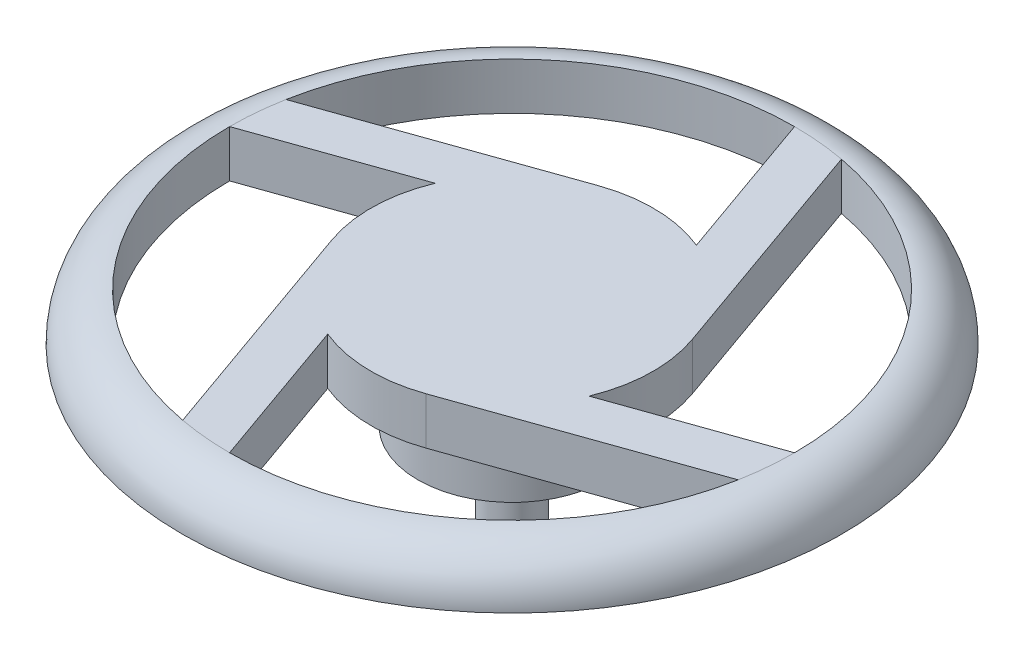
ISO-10303-21;
HEADER;
FILE_DESCRIPTION(('STEP AP214'),'2;1');
FILE_NAME('part.step','',(''),(''),'','','');
FILE_SCHEMA(('AUTOMOTIVE_DESIGN { 1 0 10303 214 1 1 1 1 }'));
ENDSEC;
DATA;
#1=APPLICATION_CONTEXT('core data for automotive mechanical design processes');
#2=APPLICATION_PROTOCOL_DEFINITION('international standard','automotive_design',2000,#1);
#3=PRODUCT_CONTEXT('',#1,'mechanical');
#4=PRODUCT('Part','Part','',(#3));
#5=PRODUCT_RELATED_PRODUCT_CATEGORY('part','',(#4));
#6=PRODUCT_DEFINITION_FORMATION('','',#4);
#7=PRODUCT_DEFINITION_CONTEXT('part definition',#1,'design');
#8=PRODUCT_DEFINITION('design','',#6,#7);
#9=PRODUCT_DEFINITION_SHAPE('','',#8);
#10=(LENGTH_UNIT() NAMED_UNIT(*) SI_UNIT(.MILLI.,.METRE.));
#11=(NAMED_UNIT(*) PLANE_ANGLE_UNIT() SI_UNIT($,.RADIAN.));
#12=(NAMED_UNIT(*) SI_UNIT($,.STERADIAN.) SOLID_ANGLE_UNIT());
#13=UNCERTAINTY_MEASURE_WITH_UNIT(LENGTH_MEASURE(1.E-05),#10,'distance_accuracy_value','');
#14=(GEOMETRIC_REPRESENTATION_CONTEXT(3) GLOBAL_UNCERTAINTY_ASSIGNED_CONTEXT((#13)) GLOBAL_UNIT_ASSIGNED_CONTEXT((#10,
#11,#12)) REPRESENTATION_CONTEXT('',''));
#15=CARTESIAN_POINT('',(0.,0.,0.));
#16=DIRECTION('',(0.,0.,1.));
#17=DIRECTION('',(1.,0.,0.));
#18=AXIS2_PLACEMENT_3D('',#15,#16,#17);
#19=CARTESIAN_POINT('',(0.,0.,0.));
#20=DIRECTION('',(0.,-1.,0.));
#21=DIRECTION('',(0.,0.,-1.));
#22=AXIS2_PLACEMENT_3D('',#19,#20,#21);
#23=TOROIDAL_SURFACE('',#22,60.,10.);
#24=CARTESIAN_POINT('',(0.,0.,0.));
#25=DIRECTION('',(0.,1.,0.));
#26=DIRECTION('',(0.,0.,1.));
#27=AXIS2_PLACEMENT_3D('',#24,#25,#26);
#28=CIRCLE('',#27,70.);
#29=CARTESIAN_POINT('',(0.,0.,70.));
#30=VERTEX_POINT('',#29);
#31=EDGE_CURVE('E274',#30,#30,#28,.T.);
#32=ORIENTED_EDGE('',*,*,#31,.T.);
#33=EDGE_LOOP('',(#32));
#34=FACE_BOUND('',#33,.T.);
#35=CARTESIAN_POINT('',(0.,10.,0.));
#36=DIRECTION('',(0.,-1.,0.));
#37=DIRECTION('',(0.,0.,-1.));
#38=AXIS2_PLACEMENT_3D('',#35,#36,#37);
#39=CIRCLE('',#38,60.);
#40=CARTESIAN_POINT('',(58.9897948556636,10.,10.9637631717731));
#41=VERTEX_POINT('',#40);
#42=CARTESIAN_POINT('',(60.,10.,0.));
#43=VERTEX_POINT('',#42);
#44=EDGE_CURVE('E74',#41,#43,#39,.F.);
#45=ORIENTED_EDGE('',*,*,#44,.F.);
#46=CARTESIAN_POINT('',(0.,10.,0.));
#47=DIRECTION('',(0.,1.,0.));
#48=DIRECTION('',(0.,0.,1.));
#49=AXIS2_PLACEMENT_3D('',#46,#47,#48);
#50=CIRCLE('',#49,60.);
#51=CARTESIAN_POINT('',(6.31439345255558E-13,10.,60.));
#52=VERTEX_POINT('',#51);
#53=EDGE_CURVE('E276',#52,#41,#50,.T.);
#54=ORIENTED_EDGE('',*,*,#53,.F.);
#55=CARTESIAN_POINT('',(0.,10.,0.));
#56=DIRECTION('',(0.,-1.,0.));
#57=DIRECTION('',(0.,0.,-1.));
#58=AXIS2_PLACEMENT_3D('',#55,#56,#57);
#59=CIRCLE('',#58,60.);
#60=CARTESIAN_POINT('',(-10.9637631717725,10.,58.9897948556637));
#61=VERTEX_POINT('',#60);
#62=EDGE_CURVE('E332',#61,#52,#59,.F.);
#63=ORIENTED_EDGE('',*,*,#62,.F.);
#64=CARTESIAN_POINT('',(-60.,10.,0.));
#65=VERTEX_POINT('',#64);
#66=EDGE_CURVE('E444',#65,#61,#50,.T.);
#67=ORIENTED_EDGE('',*,*,#66,.F.);
#68=CARTESIAN_POINT('',(0.,10.,0.));
#69=DIRECTION('',(0.,-1.,0.));
#70=DIRECTION('',(0.,0.,-1.));
#71=AXIS2_PLACEMENT_3D('',#68,#69,#70);
#72=CIRCLE('',#71,60.);
#73=CARTESIAN_POINT('',(-58.9897948556636,10.,-10.9637631717731));
#74=VERTEX_POINT('',#73);
#75=EDGE_CURVE('E335',#74,#65,#72,.F.);
#76=ORIENTED_EDGE('',*,*,#75,.F.);
#77=CARTESIAN_POINT('',(-2.09488880330588E-13,10.,-60.));
#78=VERTEX_POINT('',#77);
#79=EDGE_CURVE('E275',#78,#74,#50,.T.);
#80=ORIENTED_EDGE('',*,*,#79,.F.);
#81=CARTESIAN_POINT('',(0.,10.,0.));
#82=DIRECTION('',(0.,-1.,0.));
#83=DIRECTION('',(0.,0.,-1.));
#84=AXIS2_PLACEMENT_3D('',#81,#82,#83);
#85=CIRCLE('',#84,60.);
#86=CARTESIAN_POINT('',(10.9637631717729,10.,-58.9897948556636));
#87=VERTEX_POINT('',#86);
#88=EDGE_CURVE('E337',#87,#78,#85,.F.);
#89=ORIENTED_EDGE('',*,*,#88,.F.);
#90=EDGE_CURVE('E271',#43,#87,#50,.T.);
#91=ORIENTED_EDGE('',*,*,#90,.F.);
#92=EDGE_LOOP('',(#45,#54,#63,#67,#76,#80,#89,#91));
#93=FACE_BOUND('',#92,.T.);
#94=ADVANCED_FACE('F71',(#34,#93),#23,.T.);
#95=CARTESIAN_POINT('',(0.,10.,0.));
#96=DIRECTION('',(0.,-1.,0.));
#97=DIRECTION('',(0.,0.,-1.));
#98=AXIS2_PLACEMENT_3D('',#95,#96,#97);
#99=CYLINDRICAL_SURFACE('',#98,30.);
#100=DIRECTION('',(0.,-1.,0.));
#101=VECTOR('',#100,1.);
#102=CARTESIAN_POINT('',(28.2842712474619,10.,-10.0000000000001));
#103=LINE('',#102,#101);
#104=CARTESIAN_POINT('',(28.2842712474619,10.,-10.0000000000001));
#105=VERTEX_POINT('',#104);
#106=CARTESIAN_POINT('',(28.2842712474619,0.,-10.0000000000001));
#107=VERTEX_POINT('',#106);
#108=EDGE_CURVE('E260',#105,#107,#103,.T.);
#109=ORIENTED_EDGE('',*,*,#108,.F.);
#110=CARTESIAN_POINT('',(0.,10.,0.));
#111=DIRECTION('',(0.,1.,0.));
#112=DIRECTION('',(1.,0.,0.));
#113=AXIS2_PLACEMENT_3D('',#110,#111,#112);
#114=CIRCLE('',#113,30.);
#115=CARTESIAN_POINT('',(27.7485177344559,10.,11.402620906642));
#116=VERTEX_POINT('',#115);
#117=EDGE_CURVE('E299',#116,#105,#114,.T.);
#118=ORIENTED_EDGE('',*,*,#117,.F.);
#119=DIRECTION('',(0.,-1.,0.));
#120=VECTOR('',#119,1.);
#121=CARTESIAN_POINT('',(27.7485177344559,10.,11.402620906642));
#122=LINE('',#121,#120);
#123=CARTESIAN_POINT('',(27.7485177344559,0.,11.402620906642));
#124=VERTEX_POINT('',#123);
#125=EDGE_CURVE('E310',#124,#116,#122,.F.);
#126=ORIENTED_EDGE('',*,*,#125,.F.);
#127=CARTESIAN_POINT('',(0.,0.,0.));
#128=DIRECTION('',(0.,1.,0.));
#129=DIRECTION('',(1.,0.,0.));
#130=AXIS2_PLACEMENT_3D('',#127,#128,#129);
#131=CIRCLE('',#130,30.);
#132=EDGE_CURVE('E316',#124,#107,#131,.T.);
#133=ORIENTED_EDGE('',*,*,#132,.T.);
#134=EDGE_LOOP('',(#109,#118,#126,#133));
#135=FACE_BOUND('',#134,.T.);
#136=ADVANCED_FACE('F358',(#135),#99,.T.);
#137=DIRECTION('',(0.,-1.,0.));
#138=VECTOR('',#137,1.);
#139=CARTESIAN_POINT('',(-28.2842712474618,10.,10.0000000000003));
#140=LINE('',#139,#138);
#141=CARTESIAN_POINT('',(-28.2842712474618,10.,10.0000000000003));
#142=VERTEX_POINT('',#141);
#143=CARTESIAN_POINT('',(-28.2842712474618,0.,10.0000000000003));
#144=VERTEX_POINT('',#143);
#145=EDGE_CURVE('E215',#142,#144,#140,.T.);
#146=ORIENTED_EDGE('',*,*,#145,.F.);
#147=CARTESIAN_POINT('',(-27.7485177344559,10.,-11.402620906642));
#148=VERTEX_POINT('',#147);
#149=EDGE_CURVE('E384',#148,#142,#114,.T.);
#150=ORIENTED_EDGE('',*,*,#149,.F.);
#151=DIRECTION('',(0.,-1.,0.));
#152=VECTOR('',#151,1.);
#153=CARTESIAN_POINT('',(-27.7485177344559,10.,-11.402620906642));
#154=LINE('',#153,#152);
#155=CARTESIAN_POINT('',(-27.7485177344559,0.,-11.402620906642));
#156=VERTEX_POINT('',#155);
#157=EDGE_CURVE('E95',#156,#148,#154,.F.);
#158=ORIENTED_EDGE('',*,*,#157,.F.);
#159=EDGE_CURVE('E436',#156,#144,#131,.T.);
#160=ORIENTED_EDGE('',*,*,#159,.T.);
#161=EDGE_LOOP('',(#146,#150,#158,#160));
#162=FACE_BOUND('',#161,.T.);
#163=ADVANCED_FACE('F409',(#162),#99,.T.);
#164=CARTESIAN_POINT('',(11.4026209066419,10.,-27.7485177344559));
#165=VERTEX_POINT('',#164);
#166=CARTESIAN_POINT('',(-10.,10.,-28.2842712474619));
#167=VERTEX_POINT('',#166);
#168=EDGE_CURVE('E314',#165,#167,#114,.T.);
#169=ORIENTED_EDGE('',*,*,#168,.F.);
#170=DIRECTION('',(0.,-1.,0.));
#171=VECTOR('',#170,1.);
#172=CARTESIAN_POINT('',(11.4026209066419,10.,-27.7485177344559));
#173=LINE('',#172,#171);
#174=CARTESIAN_POINT('',(11.4026209066419,0.,-27.7485177344559));
#175=VERTEX_POINT('',#174);
#176=EDGE_CURVE('E246',#175,#165,#173,.F.);
#177=ORIENTED_EDGE('',*,*,#176,.F.);
#178=CARTESIAN_POINT('',(-10.,0.,-28.2842712474619));
#179=VERTEX_POINT('',#178);
#180=EDGE_CURVE('E319',#175,#179,#131,.T.);
#181=ORIENTED_EDGE('',*,*,#180,.T.);
#182=DIRECTION('',(0.,-1.,0.));
#183=VECTOR('',#182,1.);
#184=CARTESIAN_POINT('',(-10.,10.,-28.2842712474619));
#185=LINE('',#184,#183);
#186=EDGE_CURVE('E232',#167,#179,#185,.T.);
#187=ORIENTED_EDGE('',*,*,#186,.F.);
#188=EDGE_LOOP('',(#169,#177,#181,#187));
#189=FACE_BOUND('',#188,.T.);
#190=ADVANCED_FACE('F382',(#189),#99,.T.);
#191=CARTESIAN_POINT('',(0.,10.,0.));
#192=DIRECTION('',(0.,-1.,0.));
#193=DIRECTION('',(0.,0.,-1.));
#194=AXIS2_PLACEMENT_3D('',#191,#192,#193);
#195=CYLINDRICAL_SURFACE('',#194,60.);
#196=ORIENTED_EDGE('',*,*,#90,.T.);
#197=DIRECTION('',(0.,-1.,0.));
#198=VECTOR('',#197,1.);
#199=CARTESIAN_POINT('',(10.9637631717729,10.,-58.9897948556636));
#200=LINE('',#199,#198);
#201=CARTESIAN_POINT('',(10.9637631717729,0.,-58.9897948556636));
#202=VERTEX_POINT('',#201);
#203=EDGE_CURVE('E328',#87,#202,#200,.T.);
#204=ORIENTED_EDGE('',*,*,#203,.T.);
#205=CARTESIAN_POINT('',(0.,0.,0.));
#206=DIRECTION('',(0.,1.,0.));
#207=DIRECTION('',(0.,0.,1.));
#208=AXIS2_PLACEMENT_3D('',#205,#206,#207);
#209=CIRCLE('',#208,60.);
#210=CARTESIAN_POINT('',(60.,0.,0.));
#211=VERTEX_POINT('',#210);
#212=EDGE_CURVE('E201',#211,#202,#209,.T.);
#213=ORIENTED_EDGE('',*,*,#212,.F.);
#214=DIRECTION('',(0.,-1.,0.));
#215=VECTOR('',#214,1.);
#216=CARTESIAN_POINT('',(60.,10.,0.));
#217=LINE('',#216,#215);
#218=EDGE_CURVE('E306',#43,#211,#217,.T.);
#219=ORIENTED_EDGE('',*,*,#218,.F.);
#220=EDGE_LOOP('',(#196,#204,#213,#219));
#221=FACE_BOUND('',#220,.T.);
#222=ADVANCED_FACE('F349',(#221),#195,.F.);
#223=ORIENTED_EDGE('',*,*,#66,.T.);
#224=DIRECTION('',(0.,-1.,0.));
#225=VECTOR('',#224,1.);
#226=CARTESIAN_POINT('',(-10.9637631717725,10.,58.9897948556637));
#227=LINE('',#226,#225);
#228=CARTESIAN_POINT('',(-10.9637631717725,0.,58.9897948556637));
#229=VERTEX_POINT('',#228);
#230=EDGE_CURVE('E325',#61,#229,#227,.T.);
#231=ORIENTED_EDGE('',*,*,#230,.T.);
#232=CARTESIAN_POINT('',(-60.,0.,0.));
#233=VERTEX_POINT('',#232);
#234=EDGE_CURVE('E198',#233,#229,#209,.T.);
#235=ORIENTED_EDGE('',*,*,#234,.F.);
#236=DIRECTION('',(0.,-1.,0.));
#237=VECTOR('',#236,1.);
#238=CARTESIAN_POINT('',(-60.,10.,0.));
#239=LINE('',#238,#237);
#240=EDGE_CURVE('E242',#65,#233,#239,.T.);
#241=ORIENTED_EDGE('',*,*,#240,.F.);
#242=EDGE_LOOP('',(#223,#231,#235,#241));
#243=FACE_BOUND('',#242,.T.);
#244=ADVANCED_FACE('F451',(#243),#195,.F.);
#245=DIRECTION('',(0.,-1.,0.));
#246=VECTOR('',#245,1.);
#247=CARTESIAN_POINT('',(-2.09488880330588E-13,10.,-60.));
#248=LINE('',#247,#246);
#249=CARTESIAN_POINT('',(-2.15105711021124E-13,0.,-60.));
#250=VERTEX_POINT('',#249);
#251=EDGE_CURVE('E199',#78,#250,#248,.T.);
#252=ORIENTED_EDGE('',*,*,#251,.F.);
#253=ORIENTED_EDGE('',*,*,#79,.T.);
#254=DIRECTION('',(0.,-1.,0.));
#255=VECTOR('',#254,1.);
#256=CARTESIAN_POINT('',(-58.9897948556636,10.,-10.9637631717731));
#257=LINE('',#256,#255);
#258=CARTESIAN_POINT('',(-58.9897948556636,0.,-10.9637631717731));
#259=VERTEX_POINT('',#258);
#260=EDGE_CURVE('E322',#74,#259,#257,.T.);
#261=ORIENTED_EDGE('',*,*,#260,.T.);
#262=EDGE_CURVE('E280',#250,#259,#209,.T.);
#263=ORIENTED_EDGE('',*,*,#262,.F.);
#264=EDGE_LOOP('',(#252,#253,#261,#263));
#265=FACE_BOUND('',#264,.T.);
#266=ADVANCED_FACE('F402',(#265),#195,.F.);
#267=CARTESIAN_POINT('',(-11.4026209066417,10.,27.748517734456));
#268=VERTEX_POINT('',#267);
#269=CARTESIAN_POINT('',(10.,10.,28.2842712474619));
#270=VERTEX_POINT('',#269);
#271=EDGE_CURVE('E315',#268,#270,#114,.T.);
#272=ORIENTED_EDGE('',*,*,#271,.F.);
#273=DIRECTION('',(0.,-1.,0.));
#274=VECTOR('',#273,1.);
#275=CARTESIAN_POINT('',(-11.4026209066417,10.,27.748517734456));
#276=LINE('',#275,#274);
#277=CARTESIAN_POINT('',(-11.4026209066417,0.,27.748517734456));
#278=VERTEX_POINT('',#277);
#279=EDGE_CURVE('E417',#278,#268,#276,.F.);
#280=ORIENTED_EDGE('',*,*,#279,.F.);
#281=CARTESIAN_POINT('',(10.,0.,28.2842712474619));
#282=VERTEX_POINT('',#281);
#283=EDGE_CURVE('E205',#278,#282,#131,.T.);
#284=ORIENTED_EDGE('',*,*,#283,.T.);
#285=DIRECTION('',(0.,-1.,0.));
#286=VECTOR('',#285,1.);
#287=CARTESIAN_POINT('',(10.,10.,28.2842712474619));
#288=LINE('',#287,#286);
#289=EDGE_CURVE('E295',#270,#282,#288,.T.);
#290=ORIENTED_EDGE('',*,*,#289,.F.);
#291=EDGE_LOOP('',(#272,#280,#284,#290));
#292=FACE_BOUND('',#291,.T.);
#293=ADVANCED_FACE('F393',(#292),#99,.T.);
#294=CARTESIAN_POINT('',(6.66666666666667,10.,18.8561808316413));
#295=DIRECTION('',(-0.333333333333333,0.,-0.942809041582063));
#296=DIRECTION('',(-0.942809041582063,0.,0.333333333333333));
#297=AXIS2_PLACEMENT_3D('',#294,#295,#296);
#298=PLANE('',#297);
#299=DIRECTION('',(0.942809041582063,0.,-0.333333333333333));
#300=VECTOR('',#299,1.);
#301=CARTESIAN_POINT('',(6.66666666666667,0.,18.8561808316413));
#302=LINE('',#301,#300);
#303=EDGE_CURVE('E291',#124,#211,#302,.T.);
#304=ORIENTED_EDGE('',*,*,#303,.F.);
#305=ORIENTED_EDGE('',*,*,#125,.T.);
#306=DIRECTION('',(0.942809041582063,0.,-0.333333333333333));
#307=VECTOR('',#306,1.);
#308=CARTESIAN_POINT('',(6.66666666666667,10.,18.8561808316413));
#309=LINE('',#308,#307);
#310=EDGE_CURVE('E290',#116,#43,#309,.T.);
#311=ORIENTED_EDGE('',*,*,#310,.T.);
#312=ORIENTED_EDGE('',*,*,#218,.T.);
#313=EDGE_LOOP('',(#304,#305,#311,#312));
#314=FACE_BOUND('',#313,.T.);
#315=ADVANCED_FACE('F354',(#314),#298,.T.);
#316=CARTESIAN_POINT('',(10.,10.,28.2842712474619));
#317=DIRECTION('',(-0.333333333333333,0.,-0.942809041582063));
#318=DIRECTION('',(-0.942809041582063,0.,0.333333333333333));
#319=AXIS2_PLACEMENT_3D('',#316,#317,#318);
#320=PLANE('',#319);
#321=DIRECTION('',(0.942809041582063,0.,-0.333333333333333));
#322=VECTOR('',#321,1.);
#323=CARTESIAN_POINT('',(10.,0.,28.2842712474619));
#324=LINE('',#323,#322);
#325=CARTESIAN_POINT('',(58.9897948556636,0.,10.9637631717731));
#326=VERTEX_POINT('',#325);
#327=EDGE_CURVE('E296',#282,#326,#324,.T.);
#328=ORIENTED_EDGE('',*,*,#327,.T.);
#329=DIRECTION('',(0.,-1.,0.));
#330=VECTOR('',#329,1.);
#331=CARTESIAN_POINT('',(58.9897948556636,10.,10.9637631717731));
#332=LINE('',#331,#330);
#333=EDGE_CURVE('E193',#326,#41,#332,.F.);
#334=ORIENTED_EDGE('',*,*,#333,.T.);
#335=DIRECTION('',(0.942809041582063,0.,-0.333333333333333));
#336=VECTOR('',#335,1.);
#337=CARTESIAN_POINT('',(10.,10.,28.2842712474619));
#338=LINE('',#337,#336);
#339=EDGE_CURVE('E286',#270,#41,#338,.T.);
#340=ORIENTED_EDGE('',*,*,#339,.F.);
#341=ORIENTED_EDGE('',*,*,#289,.T.);
#342=EDGE_LOOP('',(#328,#334,#340,#341));
#343=FACE_BOUND('',#342,.T.);
#344=ADVANCED_FACE('F366',(#343),#320,.F.);
#345=CARTESIAN_POINT('',(0.,0.,0.));
#346=DIRECTION('',(0.,-1.,0.));
#347=DIRECTION('',(-1.,0.,0.));
#348=AXIS2_PLACEMENT_3D('',#345,#346,#347);
#349=PLANE('',#348);
#350=DIRECTION('',(-0.333333333333337,0.,-0.942809041582062));
#351=VECTOR('',#350,1.);
#352=CARTESIAN_POINT('',(28.2842712474619,0.,-10.0000000000001));
#353=LINE('',#352,#351);
#354=EDGE_CURVE('E250',#107,#202,#353,.T.);
#355=ORIENTED_EDGE('',*,*,#354,.F.);
#356=ORIENTED_EDGE('',*,*,#132,.F.);
#357=ORIENTED_EDGE('',*,*,#303,.T.);
#358=ORIENTED_EDGE('',*,*,#212,.T.);
#359=EDGE_LOOP('',(#355,#356,#357,#358));
#360=FACE_BOUND('',#359,.T.);
#361=DIRECTION('',(0.333333333333343,0.,0.94280904158206));
#362=VECTOR('',#361,1.);
#363=CARTESIAN_POINT('',(-28.2842712474618,0.,10.0000000000003));
#364=LINE('',#363,#362);
#365=EDGE_CURVE('E208',#144,#229,#364,.T.);
#366=ORIENTED_EDGE('',*,*,#365,.F.);
#367=ORIENTED_EDGE('',*,*,#159,.F.);
#368=DIRECTION('',(-0.942809041582063,0.,0.333333333333333));
#369=VECTOR('',#368,1.);
#370=CARTESIAN_POINT('',(-6.66666666666667,0.,-18.8561808316413));
#371=LINE('',#370,#369);
#372=EDGE_CURVE('E228',#156,#233,#371,.T.);
#373=ORIENTED_EDGE('',*,*,#372,.T.);
#374=ORIENTED_EDGE('',*,*,#234,.T.);
#375=EDGE_LOOP('',(#366,#367,#373,#374));
#376=FACE_BOUND('',#375,.T.);
#377=DIRECTION('',(-0.942809041582063,0.,0.333333333333333));
#378=VECTOR('',#377,1.);
#379=CARTESIAN_POINT('',(-10.,0.,-28.2842712474619));
#380=LINE('',#379,#378);
#381=EDGE_CURVE('E219',#179,#259,#380,.T.);
#382=ORIENTED_EDGE('',*,*,#381,.F.);
#383=ORIENTED_EDGE('',*,*,#180,.F.);
#384=DIRECTION('',(-0.333333333333337,0.,-0.942809041582062));
#385=VECTOR('',#384,1.);
#386=CARTESIAN_POINT('',(18.8561808316413,0.,-6.66666666666674));
#387=LINE('',#386,#385);
#388=EDGE_CURVE('E256',#175,#250,#387,.T.);
#389=ORIENTED_EDGE('',*,*,#388,.T.);
#390=ORIENTED_EDGE('',*,*,#262,.T.);
#391=EDGE_LOOP('',(#382,#383,#389,#390));
#392=FACE_BOUND('',#391,.T.);
#393=ORIENTED_EDGE('',*,*,#283,.F.);
#394=DIRECTION('',(0.333333333333343,0.,0.94280904158206));
#395=VECTOR('',#394,1.);
#396=CARTESIAN_POINT('',(-18.8561808316412,0.,6.66666666666687));
#397=LINE('',#396,#395);
#398=CARTESIAN_POINT('',(6.28466640991764E-13,0.,60.));
#399=VERTEX_POINT('',#398);
#400=EDGE_CURVE('E87',#278,#399,#397,.T.);
#401=ORIENTED_EDGE('',*,*,#400,.T.);
#402=EDGE_CURVE('E187',#399,#326,#209,.T.);
#403=ORIENTED_EDGE('',*,*,#402,.T.);
#404=ORIENTED_EDGE('',*,*,#327,.F.);
#405=EDGE_LOOP('',(#393,#401,#403,#404));
#406=FACE_BOUND('',#405,.T.);
#407=ORIENTED_EDGE('',*,*,#31,.F.);
#408=EDGE_LOOP('',(#407));
#409=FACE_BOUND('',#408,.T.);
#410=CARTESIAN_POINT('',(0.,0.,0.));
#411=DIRECTION('',(0.,-1.,0.));
#412=DIRECTION('',(0.,0.,-1.));
#413=AXIS2_PLACEMENT_3D('',#410,#411,#412);
#414=CIRCLE('',#413,20.);
#415=CARTESIAN_POINT('',(0.,0.,-20.));
#416=VERTEX_POINT('',#415);
#417=EDGE_CURVE('E414',#416,#416,#414,.F.);
#418=ORIENTED_EDGE('',*,*,#417,.T.);
#419=EDGE_LOOP('',(#418));
#420=FACE_BOUND('',#419,.T.);
#421=ADVANCED_FACE('F203',(#360,#376,#392,#406,#409,#420),#349,.T.);
#422=CARTESIAN_POINT('',(0.,10.,0.));
#423=DIRECTION('',(0.,-1.,0.));
#424=DIRECTION('',(-1.,0.,0.));
#425=AXIS2_PLACEMENT_3D('',#422,#423,#424);
#426=PLANE('',#425);
#427=ORIENTED_EDGE('',*,*,#339,.T.);
#428=ORIENTED_EDGE('',*,*,#44,.T.);
#429=ORIENTED_EDGE('',*,*,#310,.F.);
#430=ORIENTED_EDGE('',*,*,#117,.T.);
#431=DIRECTION('',(-0.333333333333337,0.,-0.942809041582062));
#432=VECTOR('',#431,1.);
#433=CARTESIAN_POINT('',(28.2842712474619,10.,-10.0000000000001));
#434=LINE('',#433,#432);
#435=EDGE_CURVE('E251',#105,#87,#434,.T.);
#436=ORIENTED_EDGE('',*,*,#435,.T.);
#437=ORIENTED_EDGE('',*,*,#88,.T.);
#438=DIRECTION('',(-0.333333333333337,0.,-0.942809041582062));
#439=VECTOR('',#438,1.);
#440=CARTESIAN_POINT('',(18.8561808316413,10.,-6.66666666666674));
#441=LINE('',#440,#439);
#442=EDGE_CURVE('E255',#165,#78,#441,.T.);
#443=ORIENTED_EDGE('',*,*,#442,.F.);
#444=ORIENTED_EDGE('',*,*,#168,.T.);
#445=DIRECTION('',(-0.942809041582063,0.,0.333333333333333));
#446=VECTOR('',#445,1.);
#447=CARTESIAN_POINT('',(-10.,10.,-28.2842712474619));
#448=LINE('',#447,#446);
#449=EDGE_CURVE('E223',#167,#74,#448,.T.);
#450=ORIENTED_EDGE('',*,*,#449,.T.);
#451=ORIENTED_EDGE('',*,*,#75,.T.);
#452=DIRECTION('',(-0.942809041582063,0.,0.333333333333333));
#453=VECTOR('',#452,1.);
#454=CARTESIAN_POINT('',(-6.66666666666667,10.,-18.8561808316413));
#455=LINE('',#454,#453);
#456=EDGE_CURVE('E227',#148,#65,#455,.T.);
#457=ORIENTED_EDGE('',*,*,#456,.F.);
#458=ORIENTED_EDGE('',*,*,#149,.T.);
#459=DIRECTION('',(0.333333333333343,0.,0.94280904158206));
#460=VECTOR('',#459,1.);
#461=CARTESIAN_POINT('',(-28.2842712474618,10.,10.0000000000003));
#462=LINE('',#461,#460);
#463=EDGE_CURVE('E207',#142,#61,#462,.T.);
#464=ORIENTED_EDGE('',*,*,#463,.T.);
#465=ORIENTED_EDGE('',*,*,#62,.T.);
#466=DIRECTION('',(0.333333333333343,0.,0.94280904158206));
#467=VECTOR('',#466,1.);
#468=CARTESIAN_POINT('',(-18.8561808316412,10.,6.66666666666687));
#469=LINE('',#468,#467);
#470=EDGE_CURVE('E213',#268,#52,#469,.T.);
#471=ORIENTED_EDGE('',*,*,#470,.F.);
#472=ORIENTED_EDGE('',*,*,#271,.T.);
#473=EDGE_LOOP('',(#427,#428,#429,#430,#436,#437,#443,#444,#450,#451,#457,#458,#464,#465,#471,#472));
#474=FACE_BOUND('',#473,.T.);
#475=ADVANCED_FACE('F344',(#474),#426,.F.);
#476=DIRECTION('',(0.,-1.,0.));
#477=VECTOR('',#476,1.);
#478=CARTESIAN_POINT('',(6.28466640991764E-13,10.,60.));
#479=LINE('',#478,#477);
#480=EDGE_CURVE('E190',#52,#399,#479,.T.);
#481=ORIENTED_EDGE('',*,*,#480,.F.);
#482=ORIENTED_EDGE('',*,*,#53,.T.);
#483=ORIENTED_EDGE('',*,*,#333,.F.);
#484=ORIENTED_EDGE('',*,*,#402,.F.);
#485=EDGE_LOOP('',(#481,#482,#483,#484));
#486=FACE_BOUND('',#485,.T.);
#487=ADVANCED_FACE('F188',(#486),#195,.F.);
#488=CARTESIAN_POINT('',(-10.,10.,-28.2842712474619));
#489=DIRECTION('',(0.333333333333333,0.,0.942809041582063));
#490=DIRECTION('',(0.942809041582063,0.,-0.333333333333333));
#491=AXIS2_PLACEMENT_3D('',#488,#489,#490);
#492=PLANE('',#491);
#493=ORIENTED_EDGE('',*,*,#260,.F.);
#494=ORIENTED_EDGE('',*,*,#449,.F.);
#495=ORIENTED_EDGE('',*,*,#186,.T.);
#496=ORIENTED_EDGE('',*,*,#381,.T.);
#497=EDGE_LOOP('',(#493,#494,#495,#496));
#498=FACE_BOUND('',#497,.T.);
#499=ADVANCED_FACE('F378',(#498),#492,.F.);
#500=CARTESIAN_POINT('',(-6.66666666666667,10.,-18.8561808316413));
#501=DIRECTION('',(0.333333333333333,0.,0.942809041582063));
#502=DIRECTION('',(0.942809041582063,0.,-0.333333333333333));
#503=AXIS2_PLACEMENT_3D('',#500,#501,#502);
#504=PLANE('',#503);
#505=ORIENTED_EDGE('',*,*,#372,.F.);
#506=ORIENTED_EDGE('',*,*,#157,.T.);
#507=ORIENTED_EDGE('',*,*,#456,.T.);
#508=ORIENTED_EDGE('',*,*,#240,.T.);
#509=EDGE_LOOP('',(#505,#506,#507,#508));
#510=FACE_BOUND('',#509,.T.);
#511=ADVANCED_FACE('F454',(#510),#504,.T.);
#512=CARTESIAN_POINT('',(-28.2842712474618,10.,10.0000000000003));
#513=DIRECTION('',(0.94280904158206,0.,-0.333333333333343));
#514=DIRECTION('',(-0.333333333333343,0.,-0.94280904158206));
#515=AXIS2_PLACEMENT_3D('',#512,#513,#514);
#516=PLANE('',#515);
#517=ORIENTED_EDGE('',*,*,#230,.F.);
#518=ORIENTED_EDGE('',*,*,#463,.F.);
#519=ORIENTED_EDGE('',*,*,#145,.T.);
#520=ORIENTED_EDGE('',*,*,#365,.T.);
#521=EDGE_LOOP('',(#517,#518,#519,#520));
#522=FACE_BOUND('',#521,.T.);
#523=ADVANCED_FACE('F434',(#522),#516,.F.);
#524=CARTESIAN_POINT('',(-18.8561808316412,10.,6.66666666666687));
#525=DIRECTION('',(0.94280904158206,0.,-0.333333333333343));
#526=DIRECTION('',(-0.333333333333343,0.,-0.94280904158206));
#527=AXIS2_PLACEMENT_3D('',#524,#525,#526);
#528=PLANE('',#527);
#529=ORIENTED_EDGE('',*,*,#400,.F.);
#530=ORIENTED_EDGE('',*,*,#279,.T.);
#531=ORIENTED_EDGE('',*,*,#470,.T.);
#532=ORIENTED_EDGE('',*,*,#480,.T.);
#533=EDGE_LOOP('',(#529,#530,#531,#532));
#534=FACE_BOUND('',#533,.T.);
#535=ADVANCED_FACE('F211',(#534),#528,.T.);
#536=CARTESIAN_POINT('',(18.8561808316413,10.,-6.66666666666674));
#537=DIRECTION('',(-0.942809041582062,0.,0.333333333333337));
#538=DIRECTION('',(0.333333333333337,0.,0.942809041582062));
#539=AXIS2_PLACEMENT_3D('',#536,#537,#538);
#540=PLANE('',#539);
#541=ORIENTED_EDGE('',*,*,#388,.F.);
#542=ORIENTED_EDGE('',*,*,#176,.T.);
#543=ORIENTED_EDGE('',*,*,#442,.T.);
#544=ORIENTED_EDGE('',*,*,#251,.T.);
#545=EDGE_LOOP('',(#541,#542,#543,#544));
#546=FACE_BOUND('',#545,.T.);
#547=ADVANCED_FACE('F465',(#546),#540,.T.);
#548=CARTESIAN_POINT('',(28.2842712474619,10.,-10.0000000000001));
#549=DIRECTION('',(-0.942809041582062,0.,0.333333333333337));
#550=DIRECTION('',(0.333333333333337,0.,0.942809041582062));
#551=AXIS2_PLACEMENT_3D('',#548,#549,#550);
#552=PLANE('',#551);
#553=ORIENTED_EDGE('',*,*,#203,.F.);
#554=ORIENTED_EDGE('',*,*,#435,.F.);
#555=ORIENTED_EDGE('',*,*,#108,.T.);
#556=ORIENTED_EDGE('',*,*,#354,.T.);
#557=EDGE_LOOP('',(#553,#554,#555,#556));
#558=FACE_BOUND('',#557,.T.);
#559=ADVANCED_FACE('F361',(#558),#552,.F.);
#560=CARTESIAN_POINT('',(0.,-15.,0.));
#561=DIRECTION('',(0.,1.,0.));
#562=DIRECTION('',(0.,0.,1.));
#563=AXIS2_PLACEMENT_3D('',#560,#561,#562);
#564=CYLINDRICAL_SURFACE('',#563,20.);
#565=ORIENTED_EDGE('',*,*,#417,.F.);
#566=EDGE_LOOP('',(#565));
#567=FACE_BOUND('',#566,.T.);
#568=CARTESIAN_POINT('',(0.,-15.,0.));
#569=DIRECTION('',(0.,1.,0.));
#570=DIRECTION('',(0.,0.,1.));
#571=AXIS2_PLACEMENT_3D('',#568,#569,#570);
#572=CIRCLE('',#571,20.);
#573=CARTESIAN_POINT('',(0.,-15.,20.));
#574=VERTEX_POINT('',#573);
#575=EDGE_CURVE('E418',#574,#574,#572,.F.);
#576=ORIENTED_EDGE('',*,*,#575,.F.);
#577=EDGE_LOOP('',(#576));
#578=FACE_BOUND('',#577,.T.);
#579=ADVANCED_FACE('F471',(#567,#578),#564,.T.);
#580=CARTESIAN_POINT('',(0.,-15.,0.));
#581=DIRECTION('',(0.,1.,0.));
#582=DIRECTION('',(0.,0.,1.));
#583=AXIS2_PLACEMENT_3D('',#580,#581,#582);
#584=PLANE('',#583);
#585=CARTESIAN_POINT('',(0.,-15.,0.));
#586=DIRECTION('',(0.,-1.,0.));
#587=DIRECTION('',(0.,0.,-1.));
#588=AXIS2_PLACEMENT_3D('',#585,#586,#587);
#589=CIRCLE('',#588,5.5);
#590=CARTESIAN_POINT('',(0.,-15.,-5.5));
#591=VERTEX_POINT('',#590);
#592=EDGE_CURVE('E12',#591,#591,#589,.T.);
#593=ORIENTED_EDGE('',*,*,#592,.F.);
#594=EDGE_LOOP('',(#593));
#595=FACE_BOUND('',#594,.T.);
#596=ORIENTED_EDGE('',*,*,#575,.T.);
#597=EDGE_LOOP('',(#596));
#598=FACE_BOUND('',#597,.T.);
#599=ADVANCED_FACE('F586',(#595,#598),#584,.F.);
#600=CARTESIAN_POINT('',(0.,-37.,0.));
#601=DIRECTION('',(0.,1.,0.));
#602=DIRECTION('',(0.,0.,1.));
#603=AXIS2_PLACEMENT_3D('',#600,#601,#602);
#604=CYLINDRICAL_SURFACE('',#603,5.5);
#605=CARTESIAN_POINT('',(0.,-37.,0.));
#606=DIRECTION('',(0.,-1.,0.));
#607=DIRECTION('',(0.,0.,-1.));
#608=AXIS2_PLACEMENT_3D('',#605,#606,#607);
#609=CIRCLE('',#608,5.5);
#610=CARTESIAN_POINT('',(0.,-37.,-5.5));
#611=VERTEX_POINT('',#610);
#612=EDGE_CURVE('E424',#611,#611,#609,.T.);
#613=ORIENTED_EDGE('',*,*,#612,.F.);
#614=EDGE_LOOP('',(#613));
#615=FACE_BOUND('',#614,.T.);
#616=ORIENTED_EDGE('',*,*,#592,.T.);
#617=EDGE_LOOP('',(#616));
#618=FACE_BOUND('',#617,.T.);
#619=ADVANCED_FACE('F597',(#615,#618),#604,.T.);
#620=CARTESIAN_POINT('',(0.,-37.,0.));
#621=DIRECTION('',(0.,-1.,0.));
#622=DIRECTION('',(0.,0.,-1.));
#623=AXIS2_PLACEMENT_3D('',#620,#621,#622);
#624=PLANE('',#623);
#625=ORIENTED_EDGE('',*,*,#612,.T.);
#626=EDGE_LOOP('',(#625));
#627=FACE_BOUND('',#626,.T.);
#628=ADVANCED_FACE('F612',(#627),#624,.T.);
#629=CLOSED_SHELL('',(#94,#136,#163,#190,#222,#244,#266,#293,#315,#344,#421,#475,#487,#499,#511,
#523,#535,#547,#559,#579,#599,#619,#628));
#630=MANIFOLD_SOLID_BREP('B2',#629);
#631=ADVANCED_BREP_SHAPE_REPRESENTATION('',(#18,#630),#14);
#632=SHAPE_DEFINITION_REPRESENTATION(#9,#631);
ENDSEC;
END-ISO-10303-21;
